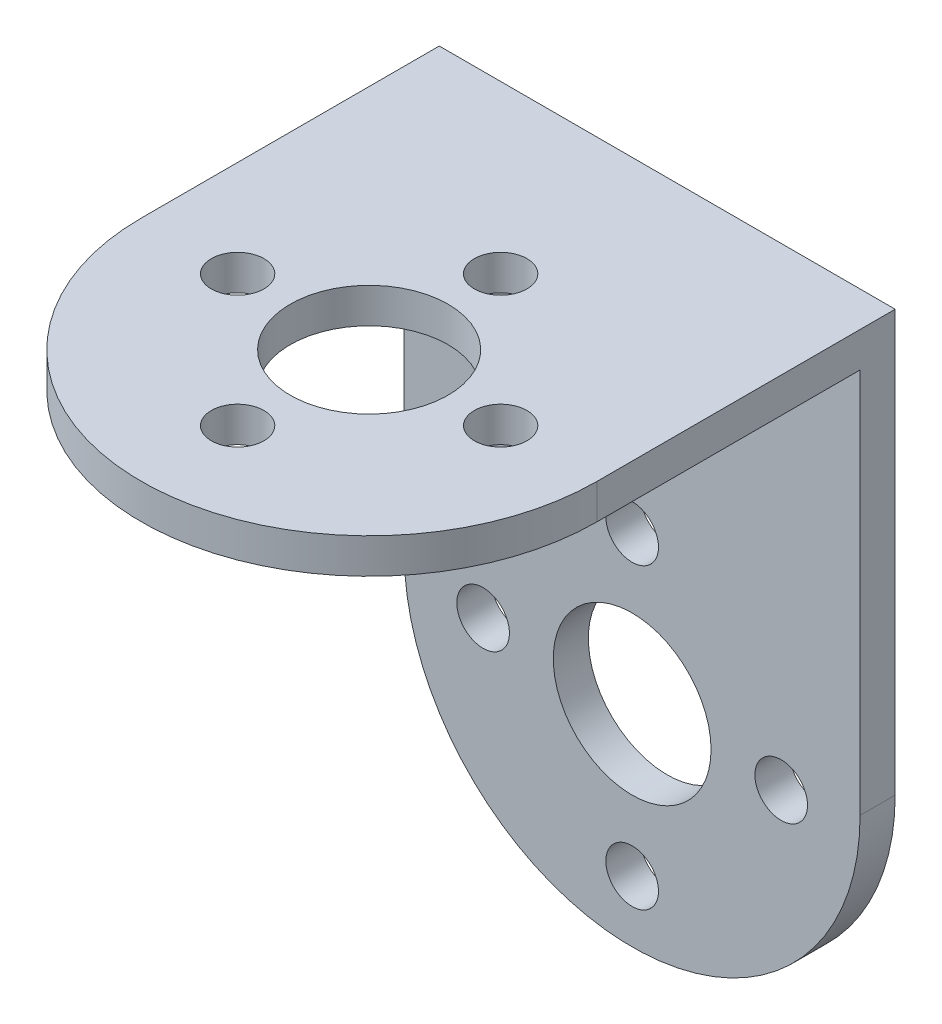
ISO-10303-21;
HEADER;
FILE_DESCRIPTION(('STEP AP214'),'2;1');
FILE_NAME('part.step','',(''),(''),'','','');
FILE_SCHEMA(('AUTOMOTIVE_DESIGN { 1 0 10303 214 1 1 1 1 }'));
ENDSEC;
DATA;
#1=APPLICATION_CONTEXT('core data for automotive mechanical design processes');
#2=APPLICATION_PROTOCOL_DEFINITION('international standard','automotive_design',2000,#1);
#3=PRODUCT_CONTEXT('',#1,'mechanical');
#4=PRODUCT('Part','Part','',(#3));
#5=PRODUCT_RELATED_PRODUCT_CATEGORY('part','',(#4));
#6=PRODUCT_DEFINITION_FORMATION('','',#4);
#7=PRODUCT_DEFINITION_CONTEXT('part definition',#1,'design');
#8=PRODUCT_DEFINITION('design','',#6,#7);
#9=PRODUCT_DEFINITION_SHAPE('','',#8);
#10=(LENGTH_UNIT() NAMED_UNIT(*) SI_UNIT(.MILLI.,.METRE.));
#11=(NAMED_UNIT(*) PLANE_ANGLE_UNIT() SI_UNIT($,.RADIAN.));
#12=(NAMED_UNIT(*) SI_UNIT($,.STERADIAN.) SOLID_ANGLE_UNIT());
#13=UNCERTAINTY_MEASURE_WITH_UNIT(LENGTH_MEASURE(1.E-05),#10,'distance_accuracy_value','');
#14=(GEOMETRIC_REPRESENTATION_CONTEXT(3) GLOBAL_UNCERTAINTY_ASSIGNED_CONTEXT((#13)) GLOBAL_UNIT_ASSIGNED_CONTEXT((#10,
#11,#12)) REPRESENTATION_CONTEXT('',''));
#15=CARTESIAN_POINT('',(0.,0.,0.));
#16=DIRECTION('',(0.,0.,1.));
#17=DIRECTION('',(1.,0.,0.));
#18=AXIS2_PLACEMENT_3D('',#15,#16,#17);
#19=CARTESIAN_POINT('',(26.,-0.999999999999997,-12.5));
#20=DIRECTION('',(0.,1.,0.));
#21=DIRECTION('',(0.,0.,1.));
#22=AXIS2_PLACEMENT_3D('',#19,#20,#21);
#23=PLANE('',#22);
#24=CARTESIAN_POINT('',(13.,-0.999999999999999,10.));
#25=DIRECTION('',(0.,-1.,0.));
#26=DIRECTION('',(0.,0.,-1.));
#27=AXIS2_PLACEMENT_3D('',#24,#25,#26);
#28=CIRCLE('',#27,1.5);
#29=CARTESIAN_POINT('',(13.,-0.999999999999999,8.50000000000001));
#30=VERTEX_POINT('',#29);
#31=EDGE_CURVE('E298',#30,#30,#28,.T.);
#32=ORIENTED_EDGE('',*,*,#31,.F.);
#33=EDGE_LOOP('',(#32));
#34=FACE_BOUND('',#33,.T.);
#35=CARTESIAN_POINT('',(13.,-0.999999999999998,2.5));
#36=DIRECTION('',(0.,-1.,0.));
#37=DIRECTION('',(0.,0.,-1.));
#38=AXIS2_PLACEMENT_3D('',#35,#36,#37);
#39=CIRCLE('',#38,4.5);
#40=CARTESIAN_POINT('',(13.,-0.999999999999998,-2.));
#41=VERTEX_POINT('',#40);
#42=EDGE_CURVE('E385',#41,#41,#39,.T.);
#43=ORIENTED_EDGE('',*,*,#42,.F.);
#44=EDGE_LOOP('',(#43));
#45=FACE_BOUND('',#44,.T.);
#46=CARTESIAN_POINT('',(13.,-0.999999999999997,-5.));
#47=DIRECTION('',(0.,-1.,0.));
#48=DIRECTION('',(0.,0.,-1.));
#49=AXIS2_PLACEMENT_3D('',#46,#47,#48);
#50=CIRCLE('',#49,1.5);
#51=CARTESIAN_POINT('',(13.,-0.999999999999997,-6.49999999999999));
#52=VERTEX_POINT('',#51);
#53=EDGE_CURVE('E374',#52,#52,#50,.T.);
#54=ORIENTED_EDGE('',*,*,#53,.F.);
#55=EDGE_LOOP('',(#54));
#56=FACE_BOUND('',#55,.T.);
#57=CARTESIAN_POINT('',(20.5,-0.999999999999998,2.50000000000001));
#58=DIRECTION('',(0.,-1.,0.));
#59=DIRECTION('',(0.,0.,-1.));
#60=AXIS2_PLACEMENT_3D('',#57,#58,#59);
#61=CIRCLE('',#60,1.5);
#62=CARTESIAN_POINT('',(20.5,-0.999999999999998,1.00000000000001));
#63=VERTEX_POINT('',#62);
#64=EDGE_CURVE('E370',#63,#63,#61,.T.);
#65=ORIENTED_EDGE('',*,*,#64,.F.);
#66=EDGE_LOOP('',(#65));
#67=FACE_BOUND('',#66,.T.);
#68=CARTESIAN_POINT('',(5.5,-0.999999999999998,2.50000000000001));
#69=DIRECTION('',(0.,-1.,0.));
#70=DIRECTION('',(0.,0.,-1.));
#71=AXIS2_PLACEMENT_3D('',#68,#69,#70);
#72=CIRCLE('',#71,1.5);
#73=CARTESIAN_POINT('',(5.5,-0.999999999999998,1.00000000000001));
#74=VERTEX_POINT('',#73);
#75=EDGE_CURVE('E377',#74,#74,#72,.T.);
#76=ORIENTED_EDGE('',*,*,#75,.F.);
#77=EDGE_LOOP('',(#76));
#78=FACE_BOUND('',#77,.T.);
#79=CARTESIAN_POINT('',(13.,-0.999999999999998,2.5));
#80=DIRECTION('',(0.,-1.,0.));
#81=DIRECTION('',(0.,0.,-1.));
#82=AXIS2_PLACEMENT_3D('',#79,#80,#81);
#83=CIRCLE('',#82,13.);
#84=CARTESIAN_POINT('',(26.,-0.999999999999998,2.5));
#85=VERTEX_POINT('',#84);
#86=CARTESIAN_POINT('',(0.,-0.999999999999998,2.5));
#87=VERTEX_POINT('',#86);
#88=EDGE_CURVE('E286',#85,#87,#83,.T.);
#89=ORIENTED_EDGE('',*,*,#88,.T.);
#90=DIRECTION('',(0.,0.,-1.));
#91=VECTOR('',#90,1.);
#92=CARTESIAN_POINT('',(0.,-0.999999999999997,-12.5));
#93=LINE('',#92,#91);
#94=CARTESIAN_POINT('',(0.,-0.999999999999997,-12.5));
#95=VERTEX_POINT('',#94);
#96=EDGE_CURVE('E294',#87,#95,#93,.T.);
#97=ORIENTED_EDGE('',*,*,#96,.T.);
#98=DIRECTION('',(-1.,0.,0.));
#99=VECTOR('',#98,1.);
#100=CARTESIAN_POINT('',(26.,-0.999999999999997,-12.5));
#101=LINE('',#100,#99);
#102=CARTESIAN_POINT('',(26.,-0.999999999999997,-12.5));
#103=VERTEX_POINT('',#102);
#104=EDGE_CURVE('E12',#103,#95,#101,.T.);
#105=ORIENTED_EDGE('',*,*,#104,.F.);
#106=DIRECTION('',(0.,0.,-1.));
#107=VECTOR('',#106,1.);
#108=CARTESIAN_POINT('',(26.,-0.999999999999997,-12.5));
#109=LINE('',#108,#107);
#110=EDGE_CURVE('E301',#85,#103,#109,.T.);
#111=ORIENTED_EDGE('',*,*,#110,.F.);
#112=EDGE_LOOP('',(#89,#97,#105,#111));
#113=FACE_BOUND('',#112,.T.);
#114=ADVANCED_FACE('F226',(#34,#45,#56,#67,#78,#113),#23,.F.);
#115=CARTESIAN_POINT('',(26.,1.,15.5));
#116=DIRECTION('',(0.,-1.,0.));
#117=DIRECTION('',(0.,0.,-1.));
#118=AXIS2_PLACEMENT_3D('',#115,#116,#117);
#119=PLANE('',#118);
#120=CARTESIAN_POINT('',(13.,1.,10.));
#121=DIRECTION('',(0.,-1.,0.));
#122=DIRECTION('',(0.,0.,-1.));
#123=AXIS2_PLACEMENT_3D('',#120,#121,#122);
#124=CIRCLE('',#123,1.5);
#125=CARTESIAN_POINT('',(13.,1.,8.50000000000001));
#126=VERTEX_POINT('',#125);
#127=EDGE_CURVE('E393',#126,#126,#124,.T.);
#128=ORIENTED_EDGE('',*,*,#127,.T.);
#129=EDGE_LOOP('',(#128));
#130=FACE_BOUND('',#129,.T.);
#131=CARTESIAN_POINT('',(13.,1.,2.5));
#132=DIRECTION('',(0.,-1.,0.));
#133=DIRECTION('',(0.,0.,-1.));
#134=AXIS2_PLACEMENT_3D('',#131,#132,#133);
#135=CIRCLE('',#134,4.5);
#136=CARTESIAN_POINT('',(13.,1.,-2.));
#137=VERTEX_POINT('',#136);
#138=EDGE_CURVE('E373',#137,#137,#135,.T.);
#139=ORIENTED_EDGE('',*,*,#138,.T.);
#140=EDGE_LOOP('',(#139));
#141=FACE_BOUND('',#140,.T.);
#142=CARTESIAN_POINT('',(13.,1.,-5.));
#143=DIRECTION('',(0.,-1.,0.));
#144=DIRECTION('',(0.,0.,-1.));
#145=AXIS2_PLACEMENT_3D('',#142,#143,#144);
#146=CIRCLE('',#145,1.5);
#147=CARTESIAN_POINT('',(13.,1.,-6.49999999999999));
#148=VERTEX_POINT('',#147);
#149=EDGE_CURVE('E378',#148,#148,#146,.T.);
#150=ORIENTED_EDGE('',*,*,#149,.T.);
#151=EDGE_LOOP('',(#150));
#152=FACE_BOUND('',#151,.T.);
#153=CARTESIAN_POINT('',(20.5,1.,2.50000000000001));
#154=DIRECTION('',(0.,-1.,0.));
#155=DIRECTION('',(0.,0.,-1.));
#156=AXIS2_PLACEMENT_3D('',#153,#154,#155);
#157=CIRCLE('',#156,1.5);
#158=CARTESIAN_POINT('',(20.5,1.,1.00000000000001));
#159=VERTEX_POINT('',#158);
#160=EDGE_CURVE('E364',#159,#159,#157,.T.);
#161=ORIENTED_EDGE('',*,*,#160,.T.);
#162=EDGE_LOOP('',(#161));
#163=FACE_BOUND('',#162,.T.);
#164=CARTESIAN_POINT('',(5.5,1.,2.50000000000001));
#165=DIRECTION('',(0.,-1.,0.));
#166=DIRECTION('',(0.,0.,-1.));
#167=AXIS2_PLACEMENT_3D('',#164,#165,#166);
#168=CIRCLE('',#167,1.5);
#169=CARTESIAN_POINT('',(5.5,1.,1.00000000000001));
#170=VERTEX_POINT('',#169);
#171=EDGE_CURVE('E390',#170,#170,#168,.T.);
#172=ORIENTED_EDGE('',*,*,#171,.T.);
#173=EDGE_LOOP('',(#172));
#174=FACE_BOUND('',#173,.T.);
#175=DIRECTION('',(0.,0.,1.));
#176=VECTOR('',#175,1.);
#177=CARTESIAN_POINT('',(0.,1.,15.5));
#178=LINE('',#177,#176);
#179=CARTESIAN_POINT('',(0.,1.,-14.5));
#180=VERTEX_POINT('',#179);
#181=CARTESIAN_POINT('',(0.,1.,2.5));
#182=VERTEX_POINT('',#181);
#183=EDGE_CURVE('E291',#180,#182,#178,.T.);
#184=ORIENTED_EDGE('',*,*,#183,.T.);
#185=CARTESIAN_POINT('',(13.,1.,2.5));
#186=DIRECTION('',(0.,-1.,0.));
#187=DIRECTION('',(0.,0.,-1.));
#188=AXIS2_PLACEMENT_3D('',#185,#186,#187);
#189=CIRCLE('',#188,13.);
#190=CARTESIAN_POINT('',(26.,1.,2.5));
#191=VERTEX_POINT('',#190);
#192=EDGE_CURVE('E279',#191,#182,#189,.T.);
#193=ORIENTED_EDGE('',*,*,#192,.F.);
#194=DIRECTION('',(0.,0.,1.));
#195=VECTOR('',#194,1.);
#196=CARTESIAN_POINT('',(26.,1.,15.5));
#197=LINE('',#196,#195);
#198=CARTESIAN_POINT('',(26.,1.,-14.5));
#199=VERTEX_POINT('',#198);
#200=EDGE_CURVE('E307',#199,#191,#197,.T.);
#201=ORIENTED_EDGE('',*,*,#200,.F.);
#202=DIRECTION('',(-1.,0.,0.));
#203=VECTOR('',#202,1.);
#204=CARTESIAN_POINT('',(26.,1.,-14.5));
#205=LINE('',#204,#203);
#206=EDGE_CURVE('E232',#199,#180,#205,.T.);
#207=ORIENTED_EDGE('',*,*,#206,.T.);
#208=EDGE_LOOP('',(#184,#193,#201,#207));
#209=FACE_BOUND('',#208,.T.);
#210=ADVANCED_FACE('F299',(#130,#141,#152,#163,#174,#209),#119,.F.);
#211=CARTESIAN_POINT('',(26.,-36.,-12.5));
#212=DIRECTION('',(0.,0.,-1.));
#213=DIRECTION('',(0.,1.,0.));
#214=AXIS2_PLACEMENT_3D('',#211,#212,#213);
#215=PLANE('',#214);
#216=CARTESIAN_POINT('',(13.,-24.,-12.5));
#217=DIRECTION('',(0.,0.,1.));
#218=DIRECTION('',(1.,0.,0.));
#219=AXIS2_PLACEMENT_3D('',#216,#217,#218);
#220=CIRCLE('',#219,4.5);
#221=CARTESIAN_POINT('',(17.5,-24.,-12.5));
#222=VERTEX_POINT('',#221);
#223=EDGE_CURVE('E343',#222,#222,#220,.T.);
#224=ORIENTED_EDGE('',*,*,#223,.F.);
#225=EDGE_LOOP('',(#224));
#226=FACE_BOUND('',#225,.T.);
#227=CARTESIAN_POINT('',(4.5,-24.,-12.5));
#228=DIRECTION('',(0.,0.,1.));
#229=DIRECTION('',(1.,0.,0.));
#230=AXIS2_PLACEMENT_3D('',#227,#228,#229);
#231=CIRCLE('',#230,1.5);
#232=CARTESIAN_POINT('',(6.,-24.,-12.5));
#233=VERTEX_POINT('',#232);
#234=EDGE_CURVE('E346',#233,#233,#231,.T.);
#235=ORIENTED_EDGE('',*,*,#234,.F.);
#236=EDGE_LOOP('',(#235));
#237=FACE_BOUND('',#236,.T.);
#238=CARTESIAN_POINT('',(13.,-32.5,-12.5));
#239=DIRECTION('',(0.,0.,1.));
#240=DIRECTION('',(1.,0.,0.));
#241=AXIS2_PLACEMENT_3D('',#238,#239,#240);
#242=CIRCLE('',#241,1.50000000000003);
#243=CARTESIAN_POINT('',(14.5,-32.5,-12.5));
#244=VERTEX_POINT('',#243);
#245=EDGE_CURVE('E337',#244,#244,#242,.T.);
#246=ORIENTED_EDGE('',*,*,#245,.F.);
#247=EDGE_LOOP('',(#246));
#248=FACE_BOUND('',#247,.T.);
#249=CARTESIAN_POINT('',(21.5,-24.,-12.5));
#250=DIRECTION('',(0.,0.,1.));
#251=DIRECTION('',(1.,0.,0.));
#252=AXIS2_PLACEMENT_3D('',#249,#250,#251);
#253=CIRCLE('',#252,1.5);
#254=CARTESIAN_POINT('',(23.,-24.,-12.5));
#255=VERTEX_POINT('',#254);
#256=EDGE_CURVE('E340',#255,#255,#253,.T.);
#257=ORIENTED_EDGE('',*,*,#256,.F.);
#258=EDGE_LOOP('',(#257));
#259=FACE_BOUND('',#258,.T.);
#260=CARTESIAN_POINT('',(13.,-15.5,-12.5));
#261=DIRECTION('',(0.,0.,1.));
#262=DIRECTION('',(1.,0.,0.));
#263=AXIS2_PLACEMENT_3D('',#260,#261,#262);
#264=CIRCLE('',#263,1.50000000000001);
#265=CARTESIAN_POINT('',(14.5,-15.5,-12.5));
#266=VERTEX_POINT('',#265);
#267=EDGE_CURVE('E321',#266,#266,#264,.T.);
#268=ORIENTED_EDGE('',*,*,#267,.F.);
#269=EDGE_LOOP('',(#268));
#270=FACE_BOUND('',#269,.T.);
#271=CARTESIAN_POINT('',(13.,-23.,-12.5));
#272=DIRECTION('',(0.,0.,1.));
#273=DIRECTION('',(1.,0.,0.));
#274=AXIS2_PLACEMENT_3D('',#271,#272,#273);
#275=CIRCLE('',#274,13.);
#276=CARTESIAN_POINT('',(0.,-23.,-12.5));
#277=VERTEX_POINT('',#276);
#278=CARTESIAN_POINT('',(26.,-23.,-12.5));
#279=VERTEX_POINT('',#278);
#280=EDGE_CURVE('E249',#277,#279,#275,.T.);
#281=ORIENTED_EDGE('',*,*,#280,.T.);
#282=DIRECTION('',(0.,-1.,0.));
#283=VECTOR('',#282,1.);
#284=CARTESIAN_POINT('',(26.,-36.,-12.5));
#285=LINE('',#284,#283);
#286=EDGE_CURVE('E302',#103,#279,#285,.T.);
#287=ORIENTED_EDGE('',*,*,#286,.F.);
#288=ORIENTED_EDGE('',*,*,#104,.T.);
#289=DIRECTION('',(0.,-1.,0.));
#290=VECTOR('',#289,1.);
#291=CARTESIAN_POINT('',(0.,-36.,-12.5));
#292=LINE('',#291,#290);
#293=EDGE_CURVE('E306',#95,#277,#292,.T.);
#294=ORIENTED_EDGE('',*,*,#293,.T.);
#295=EDGE_LOOP('',(#281,#287,#288,#294));
#296=FACE_BOUND('',#295,.T.);
#297=ADVANCED_FACE('F316',(#226,#237,#248,#259,#270,#296),#215,.F.);
#298=CARTESIAN_POINT('',(26.,1.,-14.5));
#299=DIRECTION('',(0.,0.,1.));
#300=DIRECTION('',(0.,-1.,0.));
#301=AXIS2_PLACEMENT_3D('',#298,#299,#300);
#302=PLANE('',#301);
#303=CARTESIAN_POINT('',(13.,-24.,-14.5));
#304=DIRECTION('',(0.,0.,1.));
#305=DIRECTION('',(1.,0.,0.));
#306=AXIS2_PLACEMENT_3D('',#303,#304,#305);
#307=CIRCLE('',#306,4.5);
#308=CARTESIAN_POINT('',(17.5,-24.,-14.5));
#309=VERTEX_POINT('',#308);
#310=EDGE_CURVE('E317',#309,#309,#307,.T.);
#311=ORIENTED_EDGE('',*,*,#310,.T.);
#312=EDGE_LOOP('',(#311));
#313=FACE_BOUND('',#312,.T.);
#314=CARTESIAN_POINT('',(4.5,-24.,-14.5));
#315=DIRECTION('',(0.,0.,1.));
#316=DIRECTION('',(1.,0.,0.));
#317=AXIS2_PLACEMENT_3D('',#314,#315,#316);
#318=CIRCLE('',#317,1.5);
#319=CARTESIAN_POINT('',(6.,-24.,-14.5));
#320=VERTEX_POINT('',#319);
#321=EDGE_CURVE('E345',#320,#320,#318,.T.);
#322=ORIENTED_EDGE('',*,*,#321,.T.);
#323=EDGE_LOOP('',(#322));
#324=FACE_BOUND('',#323,.T.);
#325=CARTESIAN_POINT('',(13.,-32.5,-14.5));
#326=DIRECTION('',(0.,0.,1.));
#327=DIRECTION('',(1.,0.,0.));
#328=AXIS2_PLACEMENT_3D('',#325,#326,#327);
#329=CIRCLE('',#328,1.50000000000003);
#330=CARTESIAN_POINT('',(14.5,-32.5,-14.5));
#331=VERTEX_POINT('',#330);
#332=EDGE_CURVE('E348',#331,#331,#329,.T.);
#333=ORIENTED_EDGE('',*,*,#332,.T.);
#334=EDGE_LOOP('',(#333));
#335=FACE_BOUND('',#334,.T.);
#336=CARTESIAN_POINT('',(21.5,-24.,-14.5));
#337=DIRECTION('',(0.,0.,1.));
#338=DIRECTION('',(1.,0.,0.));
#339=AXIS2_PLACEMENT_3D('',#336,#337,#338);
#340=CIRCLE('',#339,1.5);
#341=CARTESIAN_POINT('',(23.,-24.,-14.5));
#342=VERTEX_POINT('',#341);
#343=EDGE_CURVE('E332',#342,#342,#340,.T.);
#344=ORIENTED_EDGE('',*,*,#343,.T.);
#345=EDGE_LOOP('',(#344));
#346=FACE_BOUND('',#345,.T.);
#347=CARTESIAN_POINT('',(13.,-15.5,-14.5));
#348=DIRECTION('',(0.,0.,1.));
#349=DIRECTION('',(1.,0.,0.));
#350=AXIS2_PLACEMENT_3D('',#347,#348,#349);
#351=CIRCLE('',#350,1.50000000000001);
#352=CARTESIAN_POINT('',(14.5,-15.5,-14.5));
#353=VERTEX_POINT('',#352);
#354=EDGE_CURVE('E329',#353,#353,#351,.T.);
#355=ORIENTED_EDGE('',*,*,#354,.T.);
#356=EDGE_LOOP('',(#355));
#357=FACE_BOUND('',#356,.T.);
#358=DIRECTION('',(0.,1.,0.));
#359=VECTOR('',#358,1.);
#360=CARTESIAN_POINT('',(26.,1.,-14.5));
#361=LINE('',#360,#359);
#362=CARTESIAN_POINT('',(26.,-23.,-14.5));
#363=VERTEX_POINT('',#362);
#364=EDGE_CURVE('E309',#363,#199,#361,.T.);
#365=ORIENTED_EDGE('',*,*,#364,.F.);
#366=CARTESIAN_POINT('',(13.,-23.,-14.5));
#367=DIRECTION('',(0.,0.,1.));
#368=DIRECTION('',(1.,0.,0.));
#369=AXIS2_PLACEMENT_3D('',#366,#367,#368);
#370=CIRCLE('',#369,13.);
#371=CARTESIAN_POINT('',(0.,-23.,-14.5));
#372=VERTEX_POINT('',#371);
#373=EDGE_CURVE('E323',#372,#363,#370,.T.);
#374=ORIENTED_EDGE('',*,*,#373,.F.);
#375=DIRECTION('',(0.,1.,0.));
#376=VECTOR('',#375,1.);
#377=CARTESIAN_POINT('',(0.,1.,-14.5));
#378=LINE('',#377,#376);
#379=EDGE_CURVE('E305',#372,#180,#378,.T.);
#380=ORIENTED_EDGE('',*,*,#379,.T.);
#381=ORIENTED_EDGE('',*,*,#206,.F.);
#382=EDGE_LOOP('',(#365,#374,#380,#381));
#383=FACE_BOUND('',#382,.T.);
#384=ADVANCED_FACE('F463',(#313,#324,#335,#346,#357,#383),#302,.F.);
#385=CARTESIAN_POINT('',(26.,0.,0.));
#386=DIRECTION('',(-1.,0.,0.));
#387=DIRECTION('',(0.,0.,1.));
#388=AXIS2_PLACEMENT_3D('',#385,#386,#387);
#389=PLANE('',#388);
#390=ORIENTED_EDGE('',*,*,#200,.T.);
#391=DIRECTION('',(0.,-1.,0.));
#392=VECTOR('',#391,1.);
#393=CARTESIAN_POINT('',(26.,1.,2.5));
#394=LINE('',#393,#392);
#395=EDGE_CURVE('E245',#191,#85,#394,.T.);
#396=ORIENTED_EDGE('',*,*,#395,.T.);
#397=ORIENTED_EDGE('',*,*,#110,.T.);
#398=ORIENTED_EDGE('',*,*,#286,.T.);
#399=DIRECTION('',(0.,0.,1.));
#400=VECTOR('',#399,1.);
#401=CARTESIAN_POINT('',(26.,-23.,-14.5));
#402=LINE('',#401,#400);
#403=EDGE_CURVE('E359',#363,#279,#402,.T.);
#404=ORIENTED_EDGE('',*,*,#403,.F.);
#405=ORIENTED_EDGE('',*,*,#364,.T.);
#406=EDGE_LOOP('',(#390,#396,#397,#398,#404,#405));
#407=FACE_BOUND('',#406,.T.);
#408=ADVANCED_FACE('F360',(#407),#389,.F.);
#409=CARTESIAN_POINT('',(0.,0.,0.));
#410=DIRECTION('',(-1.,0.,0.));
#411=DIRECTION('',(0.,0.,1.));
#412=AXIS2_PLACEMENT_3D('',#409,#410,#411);
#413=PLANE('',#412);
#414=DIRECTION('',(0.,-1.,0.));
#415=VECTOR('',#414,1.);
#416=CARTESIAN_POINT('',(0.,1.,2.5));
#417=LINE('',#416,#415);
#418=EDGE_CURVE('E281',#182,#87,#417,.T.);
#419=ORIENTED_EDGE('',*,*,#418,.F.);
#420=ORIENTED_EDGE('',*,*,#183,.F.);
#421=ORIENTED_EDGE('',*,*,#379,.F.);
#422=DIRECTION('',(0.,0.,1.));
#423=VECTOR('',#422,1.);
#424=CARTESIAN_POINT('',(0.,-23.,-14.5));
#425=LINE('',#424,#423);
#426=EDGE_CURVE('E325',#372,#277,#425,.T.);
#427=ORIENTED_EDGE('',*,*,#426,.T.);
#428=ORIENTED_EDGE('',*,*,#293,.F.);
#429=ORIENTED_EDGE('',*,*,#96,.F.);
#430=EDGE_LOOP('',(#419,#420,#421,#427,#428,#429));
#431=FACE_BOUND('',#430,.T.);
#432=ADVANCED_FACE('F293',(#431),#413,.T.);
#433=CARTESIAN_POINT('',(13.,-23.,-14.5));
#434=DIRECTION('',(0.,0.,1.));
#435=DIRECTION('',(1.,0.,0.));
#436=AXIS2_PLACEMENT_3D('',#433,#434,#435);
#437=CYLINDRICAL_SURFACE('',#436,13.);
#438=ORIENTED_EDGE('',*,*,#280,.F.);
#439=ORIENTED_EDGE('',*,*,#426,.F.);
#440=ORIENTED_EDGE('',*,*,#373,.T.);
#441=ORIENTED_EDGE('',*,*,#403,.T.);
#442=EDGE_LOOP('',(#438,#439,#440,#441));
#443=FACE_BOUND('',#442,.T.);
#444=ADVANCED_FACE('F440',(#443),#437,.T.);
#445=CARTESIAN_POINT('',(13.,-24.,-14.5));
#446=DIRECTION('',(0.,0.,1.));
#447=DIRECTION('',(1.,0.,0.));
#448=AXIS2_PLACEMENT_3D('',#445,#446,#447);
#449=CYLINDRICAL_SURFACE('',#448,4.5);
#450=ORIENTED_EDGE('',*,*,#310,.F.);
#451=EDGE_LOOP('',(#450));
#452=FACE_BOUND('',#451,.T.);
#453=ORIENTED_EDGE('',*,*,#223,.T.);
#454=EDGE_LOOP('',(#453));
#455=FACE_BOUND('',#454,.T.);
#456=ADVANCED_FACE('F439',(#452,#455),#449,.F.);
#457=CARTESIAN_POINT('',(4.5,-24.,-14.5));
#458=DIRECTION('',(0.,0.,1.));
#459=DIRECTION('',(1.,0.,0.));
#460=AXIS2_PLACEMENT_3D('',#457,#458,#459);
#461=CYLINDRICAL_SURFACE('',#460,1.5);
#462=ORIENTED_EDGE('',*,*,#321,.F.);
#463=EDGE_LOOP('',(#462));
#464=FACE_BOUND('',#463,.T.);
#465=ORIENTED_EDGE('',*,*,#234,.T.);
#466=EDGE_LOOP('',(#465));
#467=FACE_BOUND('',#466,.T.);
#468=ADVANCED_FACE('F446',(#464,#467),#461,.F.);
#469=CARTESIAN_POINT('',(13.,-32.5,-14.5));
#470=DIRECTION('',(0.,0.,1.));
#471=DIRECTION('',(1.,0.,0.));
#472=AXIS2_PLACEMENT_3D('',#469,#470,#471);
#473=CYLINDRICAL_SURFACE('',#472,1.50000000000003);
#474=ORIENTED_EDGE('',*,*,#332,.F.);
#475=EDGE_LOOP('',(#474));
#476=FACE_BOUND('',#475,.T.);
#477=ORIENTED_EDGE('',*,*,#245,.T.);
#478=EDGE_LOOP('',(#477));
#479=FACE_BOUND('',#478,.T.);
#480=ADVANCED_FACE('F443',(#476,#479),#473,.F.);
#481=CARTESIAN_POINT('',(21.5,-24.,-14.5));
#482=DIRECTION('',(0.,0.,1.));
#483=DIRECTION('',(1.,0.,0.));
#484=AXIS2_PLACEMENT_3D('',#481,#482,#483);
#485=CYLINDRICAL_SURFACE('',#484,1.5);
#486=ORIENTED_EDGE('',*,*,#343,.F.);
#487=EDGE_LOOP('',(#486));
#488=FACE_BOUND('',#487,.T.);
#489=ORIENTED_EDGE('',*,*,#256,.T.);
#490=EDGE_LOOP('',(#489));
#491=FACE_BOUND('',#490,.T.);
#492=ADVANCED_FACE('F441',(#488,#491),#485,.F.);
#493=CARTESIAN_POINT('',(13.,-15.5,-14.5));
#494=DIRECTION('',(0.,0.,1.));
#495=DIRECTION('',(1.,0.,0.));
#496=AXIS2_PLACEMENT_3D('',#493,#494,#495);
#497=CYLINDRICAL_SURFACE('',#496,1.50000000000001);
#498=ORIENTED_EDGE('',*,*,#354,.F.);
#499=EDGE_LOOP('',(#498));
#500=FACE_BOUND('',#499,.T.);
#501=ORIENTED_EDGE('',*,*,#267,.T.);
#502=EDGE_LOOP('',(#501));
#503=FACE_BOUND('',#502,.T.);
#504=ADVANCED_FACE('F435',(#500,#503),#497,.F.);
#505=CARTESIAN_POINT('',(13.,1.,-5.));
#506=DIRECTION('',(0.,-1.,0.));
#507=DIRECTION('',(0.,0.,-1.));
#508=AXIS2_PLACEMENT_3D('',#505,#506,#507);
#509=CYLINDRICAL_SURFACE('',#508,1.5);
#510=ORIENTED_EDGE('',*,*,#149,.F.);
#511=EDGE_LOOP('',(#510));
#512=FACE_BOUND('',#511,.T.);
#513=ORIENTED_EDGE('',*,*,#53,.T.);
#514=EDGE_LOOP('',(#513));
#515=FACE_BOUND('',#514,.T.);
#516=ADVANCED_FACE('F429',(#512,#515),#509,.F.);
#517=CARTESIAN_POINT('',(13.,1.,2.5));
#518=DIRECTION('',(0.,-1.,0.));
#519=DIRECTION('',(0.,0.,-1.));
#520=AXIS2_PLACEMENT_3D('',#517,#518,#519);
#521=CYLINDRICAL_SURFACE('',#520,4.5);
#522=ORIENTED_EDGE('',*,*,#138,.F.);
#523=EDGE_LOOP('',(#522));
#524=FACE_BOUND('',#523,.T.);
#525=ORIENTED_EDGE('',*,*,#42,.T.);
#526=EDGE_LOOP('',(#525));
#527=FACE_BOUND('',#526,.T.);
#528=ADVANCED_FACE('F430',(#524,#527),#521,.F.);
#529=CARTESIAN_POINT('',(13.,1.,2.5));
#530=DIRECTION('',(0.,-1.,0.));
#531=DIRECTION('',(0.,0.,-1.));
#532=AXIS2_PLACEMENT_3D('',#529,#530,#531);
#533=CYLINDRICAL_SURFACE('',#532,13.);
#534=ORIENTED_EDGE('',*,*,#88,.F.);
#535=ORIENTED_EDGE('',*,*,#395,.F.);
#536=ORIENTED_EDGE('',*,*,#192,.T.);
#537=ORIENTED_EDGE('',*,*,#418,.T.);
#538=EDGE_LOOP('',(#534,#535,#536,#537));
#539=FACE_BOUND('',#538,.T.);
#540=ADVANCED_FACE('F278',(#539),#533,.T.);
#541=CARTESIAN_POINT('',(20.5,1.,2.50000000000001));
#542=DIRECTION('',(0.,-1.,0.));
#543=DIRECTION('',(0.,0.,-1.));
#544=AXIS2_PLACEMENT_3D('',#541,#542,#543);
#545=CYLINDRICAL_SURFACE('',#544,1.5);
#546=ORIENTED_EDGE('',*,*,#160,.F.);
#547=EDGE_LOOP('',(#546));
#548=FACE_BOUND('',#547,.T.);
#549=ORIENTED_EDGE('',*,*,#64,.T.);
#550=EDGE_LOOP('',(#549));
#551=FACE_BOUND('',#550,.T.);
#552=ADVANCED_FACE('F413',(#548,#551),#545,.F.);
#553=CARTESIAN_POINT('',(5.5,1.,2.50000000000001));
#554=DIRECTION('',(0.,-1.,0.));
#555=DIRECTION('',(0.,0.,-1.));
#556=AXIS2_PLACEMENT_3D('',#553,#554,#555);
#557=CYLINDRICAL_SURFACE('',#556,1.5);
#558=ORIENTED_EDGE('',*,*,#171,.F.);
#559=EDGE_LOOP('',(#558));
#560=FACE_BOUND('',#559,.T.);
#561=ORIENTED_EDGE('',*,*,#75,.T.);
#562=EDGE_LOOP('',(#561));
#563=FACE_BOUND('',#562,.T.);
#564=ADVANCED_FACE('F412',(#560,#563),#557,.F.);
#565=CARTESIAN_POINT('',(13.,1.,10.));
#566=DIRECTION('',(0.,-1.,0.));
#567=DIRECTION('',(0.,0.,-1.));
#568=AXIS2_PLACEMENT_3D('',#565,#566,#567);
#569=CYLINDRICAL_SURFACE('',#568,1.5);
#570=ORIENTED_EDGE('',*,*,#127,.F.);
#571=EDGE_LOOP('',(#570));
#572=FACE_BOUND('',#571,.T.);
#573=ORIENTED_EDGE('',*,*,#31,.T.);
#574=EDGE_LOOP('',(#573));
#575=FACE_BOUND('',#574,.T.);
#576=ADVANCED_FACE('F396',(#572,#575),#569,.F.);
#577=CLOSED_SHELL('',(#114,#210,#297,#384,#408,#432,#444,#456,#468,#480,#492,#504,#516,#528,
#540,#552,#564,#576));
#578=MANIFOLD_SOLID_BREP('B2',#577);
#579=ADVANCED_BREP_SHAPE_REPRESENTATION('',(#18,#578),#14);
#580=SHAPE_DEFINITION_REPRESENTATION(#9,#579);
ENDSEC;
END-ISO-10303-21;
